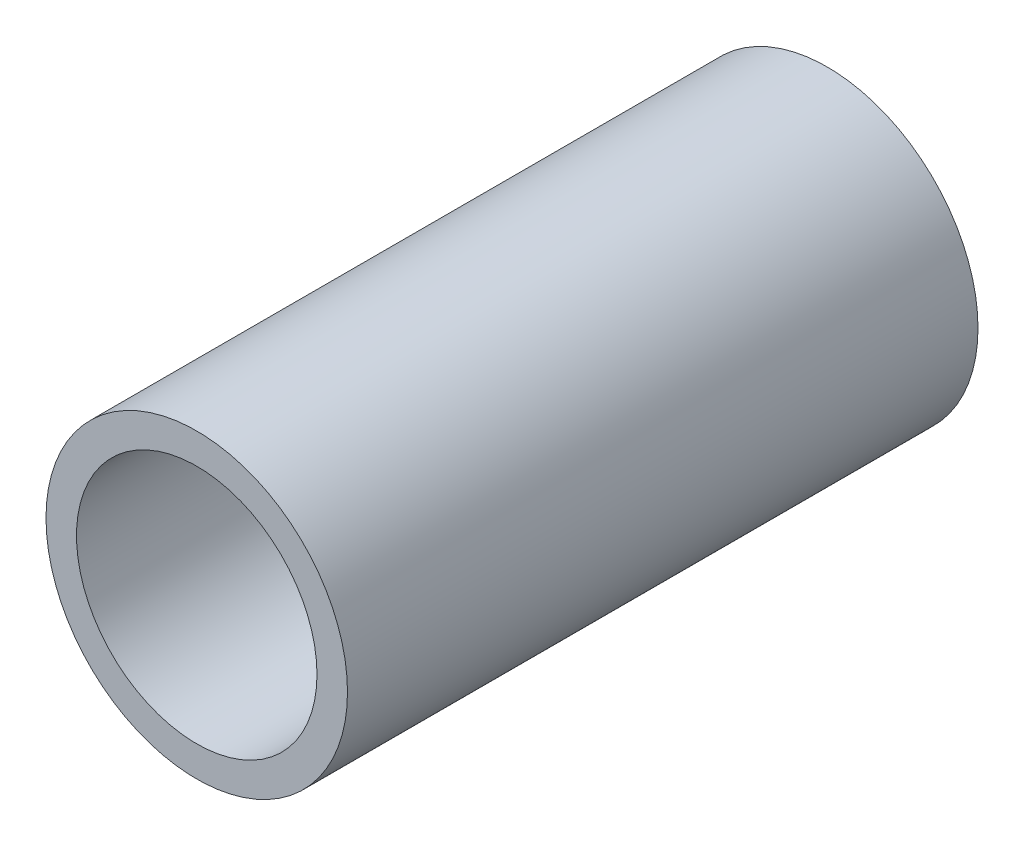
ISO-10303-21;
HEADER;
FILE_DESCRIPTION(('STEP AP214'),'2;1');
FILE_NAME('part.step','',(''),(''),'','','');
FILE_SCHEMA(('AUTOMOTIVE_DESIGN { 1 0 10303 214 1 1 1 1 }'));
ENDSEC;
DATA;
#1=APPLICATION_CONTEXT('core data for automotive mechanical design processes');
#2=APPLICATION_PROTOCOL_DEFINITION('international standard','automotive_design',2000,#1);
#3=PRODUCT_CONTEXT('',#1,'mechanical');
#4=PRODUCT('Part','Part','',(#3));
#5=PRODUCT_RELATED_PRODUCT_CATEGORY('part','',(#4));
#6=PRODUCT_DEFINITION_FORMATION('','',#4);
#7=PRODUCT_DEFINITION_CONTEXT('part definition',#1,'design');
#8=PRODUCT_DEFINITION('design','',#6,#7);
#9=PRODUCT_DEFINITION_SHAPE('','',#8);
#10=(LENGTH_UNIT() NAMED_UNIT(*) SI_UNIT(.MILLI.,.METRE.));
#11=(NAMED_UNIT(*) PLANE_ANGLE_UNIT() SI_UNIT($,.RADIAN.));
#12=(NAMED_UNIT(*) SI_UNIT($,.STERADIAN.) SOLID_ANGLE_UNIT());
#13=UNCERTAINTY_MEASURE_WITH_UNIT(LENGTH_MEASURE(1.E-05),#10,'distance_accuracy_value','');
#14=(GEOMETRIC_REPRESENTATION_CONTEXT(3) GLOBAL_UNCERTAINTY_ASSIGNED_CONTEXT((#13)) GLOBAL_UNIT_ASSIGNED_CONTEXT((#10,
#11,#12)) REPRESENTATION_CONTEXT('',''));
#15=CARTESIAN_POINT('',(0.,0.,0.));
#16=DIRECTION('',(0.,0.,1.));
#17=DIRECTION('',(1.,0.,0.));
#18=AXIS2_PLACEMENT_3D('',#15,#16,#17);
#19=CARTESIAN_POINT('',(0.,0.,34.925));
#20=DIRECTION('',(0.,0.,1.));
#21=DIRECTION('',(1.,0.,0.));
#22=AXIS2_PLACEMENT_3D('',#19,#20,#21);
#23=PLANE('',#22);
#24=CARTESIAN_POINT('',(0.,0.,34.925));
#25=DIRECTION('',(0.,0.,1.));
#26=DIRECTION('',(1.,0.,0.));
#27=AXIS2_PLACEMENT_3D('',#24,#25,#26);
#28=CIRCLE('',#27,16.7005);
#29=CARTESIAN_POINT('',(16.7005,0.,34.925));
#30=VERTEX_POINT('',#29);
#31=EDGE_CURVE('E11',#30,#30,#28,.T.);
#32=ORIENTED_EDGE('',*,*,#31,.T.);
#33=EDGE_LOOP('',(#32));
#34=FACE_BOUND('',#33,.T.);
#35=CARTESIAN_POINT('',(0.,0.,34.925));
#36=DIRECTION('',(0.,0.,1.));
#37=DIRECTION('',(1.,0.,0.));
#38=AXIS2_PLACEMENT_3D('',#35,#36,#37);
#39=CIRCLE('',#38,13.3223);
#40=CARTESIAN_POINT('',(13.3223,0.,34.925));
#41=VERTEX_POINT('',#40);
#42=EDGE_CURVE('E50',#41,#41,#39,.T.);
#43=ORIENTED_EDGE('',*,*,#42,.F.);
#44=EDGE_LOOP('',(#43));
#45=FACE_BOUND('',#44,.T.);
#46=ADVANCED_FACE('F39',(#34,#45),#23,.T.);
#47=CARTESIAN_POINT('',(0.,0.,-34.925));
#48=DIRECTION('',(0.,0.,1.));
#49=DIRECTION('',(1.,0.,0.));
#50=AXIS2_PLACEMENT_3D('',#47,#48,#49);
#51=PLANE('',#50);
#52=CARTESIAN_POINT('',(0.,0.,-34.925));
#53=DIRECTION('',(0.,0.,1.));
#54=DIRECTION('',(1.,0.,0.));
#55=AXIS2_PLACEMENT_3D('',#52,#53,#54);
#56=CIRCLE('',#55,16.7005);
#57=CARTESIAN_POINT('',(16.7005,0.,-34.925));
#58=VERTEX_POINT('',#57);
#59=EDGE_CURVE('E43',#58,#58,#56,.T.);
#60=ORIENTED_EDGE('',*,*,#59,.F.);
#61=EDGE_LOOP('',(#60));
#62=FACE_BOUND('',#61,.T.);
#63=CARTESIAN_POINT('',(0.,0.,-34.925));
#64=DIRECTION('',(0.,0.,1.));
#65=DIRECTION('',(1.,0.,0.));
#66=AXIS2_PLACEMENT_3D('',#63,#64,#65);
#67=CIRCLE('',#66,13.3223);
#68=CARTESIAN_POINT('',(13.3223,0.,-34.925));
#69=VERTEX_POINT('',#68);
#70=EDGE_CURVE('E52',#69,#69,#67,.T.);
#71=ORIENTED_EDGE('',*,*,#70,.T.);
#72=EDGE_LOOP('',(#71));
#73=FACE_BOUND('',#72,.T.);
#74=ADVANCED_FACE('F62',(#62,#73),#51,.F.);
#75=CARTESIAN_POINT('',(0.,0.,34.925));
#76=DIRECTION('',(0.,0.,-1.));
#77=DIRECTION('',(-1.,0.,0.));
#78=AXIS2_PLACEMENT_3D('',#75,#76,#77);
#79=CYLINDRICAL_SURFACE('',#78,16.7005);
#80=ORIENTED_EDGE('',*,*,#31,.F.);
#81=EDGE_LOOP('',(#80));
#82=FACE_BOUND('',#81,.T.);
#83=ORIENTED_EDGE('',*,*,#59,.T.);
#84=EDGE_LOOP('',(#83));
#85=FACE_BOUND('',#84,.T.);
#86=ADVANCED_FACE('F41',(#82,#85),#79,.T.);
#87=CARTESIAN_POINT('',(0.,0.,34.925));
#88=DIRECTION('',(0.,0.,-1.));
#89=DIRECTION('',(-1.,0.,0.));
#90=AXIS2_PLACEMENT_3D('',#87,#88,#89);
#91=CYLINDRICAL_SURFACE('',#90,13.3223);
#92=ORIENTED_EDGE('',*,*,#42,.T.);
#93=EDGE_LOOP('',(#92));
#94=FACE_BOUND('',#93,.T.);
#95=ORIENTED_EDGE('',*,*,#70,.F.);
#96=EDGE_LOOP('',(#95));
#97=FACE_BOUND('',#96,.T.);
#98=ADVANCED_FACE('F58',(#94,#97),#91,.F.);
#99=CLOSED_SHELL('',(#46,#74,#86,#98));
#100=MANIFOLD_SOLID_BREP('B2',#99);
#101=ADVANCED_BREP_SHAPE_REPRESENTATION('',(#18,#100),#14);
#102=SHAPE_DEFINITION_REPRESENTATION(#9,#101);
ENDSEC;
END-ISO-10303-21;
